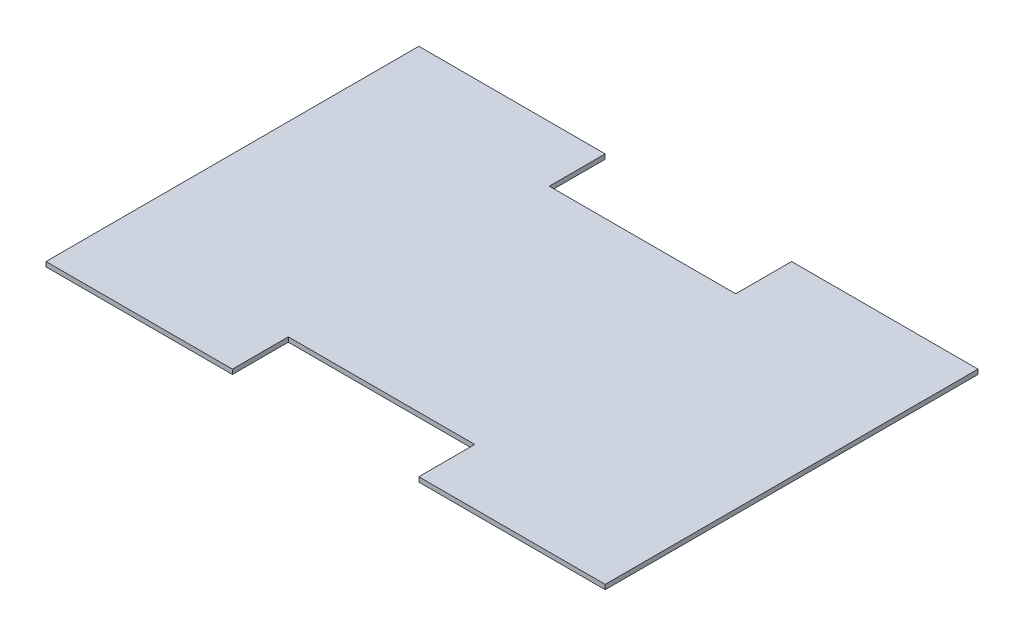
ISO-10303-21;
HEADER;
FILE_DESCRIPTION(('STEP AP214'),'2;1');
FILE_NAME('part.step','',(''),(''),'','','');
FILE_SCHEMA(('AUTOMOTIVE_DESIGN { 1 0 10303 214 1 1 1 1 }'));
ENDSEC;
DATA;
#1=APPLICATION_CONTEXT('core data for automotive mechanical design processes');
#2=APPLICATION_PROTOCOL_DEFINITION('international standard','automotive_design',2000,#1);
#3=PRODUCT_CONTEXT('',#1,'mechanical');
#4=PRODUCT('Part','Part','',(#3));
#5=PRODUCT_RELATED_PRODUCT_CATEGORY('part','',(#4));
#6=PRODUCT_DEFINITION_FORMATION('','',#4);
#7=PRODUCT_DEFINITION_CONTEXT('part definition',#1,'design');
#8=PRODUCT_DEFINITION('design','',#6,#7);
#9=PRODUCT_DEFINITION_SHAPE('','',#8);
#10=(LENGTH_UNIT() NAMED_UNIT(*) SI_UNIT(.MILLI.,.METRE.));
#11=(NAMED_UNIT(*) PLANE_ANGLE_UNIT() SI_UNIT($,.RADIAN.));
#12=(NAMED_UNIT(*) SI_UNIT($,.STERADIAN.) SOLID_ANGLE_UNIT());
#13=UNCERTAINTY_MEASURE_WITH_UNIT(LENGTH_MEASURE(1.E-05),#10,'distance_accuracy_value','');
#14=(GEOMETRIC_REPRESENTATION_CONTEXT(3) GLOBAL_UNCERTAINTY_ASSIGNED_CONTEXT((#13)) GLOBAL_UNIT_ASSIGNED_CONTEXT((#10,
#11,#12)) REPRESENTATION_CONTEXT('',''));
#15=CARTESIAN_POINT('',(0.,0.,0.));
#16=DIRECTION('',(0.,0.,1.));
#17=DIRECTION('',(1.,0.,0.));
#18=AXIS2_PLACEMENT_3D('',#15,#16,#17);
#19=CARTESIAN_POINT('',(-300.,5.,-200.));
#20=DIRECTION('',(0.,0.,1.));
#21=DIRECTION('',(1.,0.,0.));
#22=AXIS2_PLACEMENT_3D('',#19,#20,#21);
#23=PLANE('',#22);
#24=DIRECTION('',(0.,1.,0.));
#25=VECTOR('',#24,1.);
#26=CARTESIAN_POINT('',(100.,0.,-200.));
#27=LINE('',#26,#25);
#28=CARTESIAN_POINT('',(100.,0.,-200.));
#29=VERTEX_POINT('',#28);
#30=CARTESIAN_POINT('',(100.,5.,-200.));
#31=VERTEX_POINT('',#30);
#32=EDGE_CURVE('E62',#29,#31,#27,.T.);
#33=ORIENTED_EDGE('',*,*,#32,.T.);
#34=DIRECTION('',(-1.,0.,0.));
#35=VECTOR('',#34,1.);
#36=CARTESIAN_POINT('',(-300.,5.,-200.));
#37=LINE('',#36,#35);
#38=CARTESIAN_POINT('',(300.,5.,-200.));
#39=VERTEX_POINT('',#38);
#40=EDGE_CURVE('E211',#39,#31,#37,.T.);
#41=ORIENTED_EDGE('',*,*,#40,.F.);
#42=DIRECTION('',(0.,-1.,0.));
#43=VECTOR('',#42,1.);
#44=CARTESIAN_POINT('',(300.,5.,-200.));
#45=LINE('',#44,#43);
#46=CARTESIAN_POINT('',(300.,0.,-200.));
#47=VERTEX_POINT('',#46);
#48=EDGE_CURVE('E11',#39,#47,#45,.T.);
#49=ORIENTED_EDGE('',*,*,#48,.T.);
#50=DIRECTION('',(-1.,0.,0.));
#51=VECTOR('',#50,1.);
#52=CARTESIAN_POINT('',(-300.,0.,-200.));
#53=LINE('',#52,#51);
#54=EDGE_CURVE('E228',#47,#29,#53,.T.);
#55=ORIENTED_EDGE('',*,*,#54,.T.);
#56=EDGE_LOOP('',(#33,#41,#49,#55));
#57=FACE_BOUND('',#56,.T.);
#58=ADVANCED_FACE('F38',(#57),#23,.F.);
#59=CARTESIAN_POINT('',(-300.,5.,200.));
#60=DIRECTION('',(0.,0.,-1.));
#61=DIRECTION('',(-1.,0.,0.));
#62=AXIS2_PLACEMENT_3D('',#59,#60,#61);
#63=PLANE('',#62);
#64=DIRECTION('',(0.,1.,0.));
#65=VECTOR('',#64,1.);
#66=CARTESIAN_POINT('',(-100.,0.,200.));
#67=LINE('',#66,#65);
#68=CARTESIAN_POINT('',(-100.,0.,200.));
#69=VERTEX_POINT('',#68);
#70=CARTESIAN_POINT('',(-100.,5.,200.));
#71=VERTEX_POINT('',#70);
#72=EDGE_CURVE('E183',#69,#71,#67,.T.);
#73=ORIENTED_EDGE('',*,*,#72,.T.);
#74=DIRECTION('',(1.,0.,0.));
#75=VECTOR('',#74,1.);
#76=CARTESIAN_POINT('',(-300.,5.,200.));
#77=LINE('',#76,#75);
#78=CARTESIAN_POINT('',(-300.,5.,200.));
#79=VERTEX_POINT('',#78);
#80=EDGE_CURVE('E219',#79,#71,#77,.T.);
#81=ORIENTED_EDGE('',*,*,#80,.F.);
#82=DIRECTION('',(0.,-1.,0.));
#83=VECTOR('',#82,1.);
#84=CARTESIAN_POINT('',(-300.,5.,200.));
#85=LINE('',#84,#83);
#86=CARTESIAN_POINT('',(-300.,0.,200.));
#87=VERTEX_POINT('',#86);
#88=EDGE_CURVE('E241',#79,#87,#85,.T.);
#89=ORIENTED_EDGE('',*,*,#88,.T.);
#90=DIRECTION('',(1.,0.,0.));
#91=VECTOR('',#90,1.);
#92=CARTESIAN_POINT('',(-300.,0.,200.));
#93=LINE('',#92,#91);
#94=EDGE_CURVE('E210',#87,#69,#93,.T.);
#95=ORIENTED_EDGE('',*,*,#94,.T.);
#96=EDGE_LOOP('',(#73,#81,#89,#95));
#97=FACE_BOUND('',#96,.T.);
#98=ADVANCED_FACE('F258',(#97),#63,.F.);
#99=CARTESIAN_POINT('',(0.,5.,0.));
#100=DIRECTION('',(0.,-1.,0.));
#101=DIRECTION('',(0.,0.,-1.));
#102=AXIS2_PLACEMENT_3D('',#99,#100,#101);
#103=PLANE('',#102);
#104=DIRECTION('',(1.,0.,0.));
#105=VECTOR('',#104,1.);
#106=CARTESIAN_POINT('',(0.,5.,-140.));
#107=LINE('',#106,#105);
#108=CARTESIAN_POINT('',(-100.,5.,-140.));
#109=VERTEX_POINT('',#108);
#110=CARTESIAN_POINT('',(100.,5.,-140.));
#111=VERTEX_POINT('',#110);
#112=EDGE_CURVE('E142',#109,#111,#107,.T.);
#113=ORIENTED_EDGE('',*,*,#112,.F.);
#114=DIRECTION('',(0.,0.,1.));
#115=VECTOR('',#114,1.);
#116=CARTESIAN_POINT('',(-99.9999999999999,5.,0.));
#117=LINE('',#116,#115);
#118=CARTESIAN_POINT('',(-100.,5.,-200.));
#119=VERTEX_POINT('',#118);
#120=EDGE_CURVE('E149',#119,#109,#117,.T.);
#121=ORIENTED_EDGE('',*,*,#120,.F.);
#122=CARTESIAN_POINT('',(-300.,5.,-200.));
#123=VERTEX_POINT('',#122);
#124=EDGE_CURVE('E209',#119,#123,#37,.T.);
#125=ORIENTED_EDGE('',*,*,#124,.T.);
#126=DIRECTION('',(0.,0.,1.));
#127=VECTOR('',#126,1.);
#128=CARTESIAN_POINT('',(-300.,5.,200.));
#129=LINE('',#128,#127);
#130=EDGE_CURVE('E215',#123,#79,#129,.T.);
#131=ORIENTED_EDGE('',*,*,#130,.T.);
#132=ORIENTED_EDGE('',*,*,#80,.T.);
#133=DIRECTION('',(0.,0.,-1.));
#134=VECTOR('',#133,1.);
#135=CARTESIAN_POINT('',(-100.,5.,0.));
#136=LINE('',#135,#134);
#137=CARTESIAN_POINT('',(-100.,5.,140.));
#138=VERTEX_POINT('',#137);
#139=EDGE_CURVE('E184',#71,#138,#136,.T.);
#140=ORIENTED_EDGE('',*,*,#139,.T.);
#141=DIRECTION('',(1.,0.,0.));
#142=VECTOR('',#141,1.);
#143=CARTESIAN_POINT('',(0.,5.,140.));
#144=LINE('',#143,#142);
#145=CARTESIAN_POINT('',(100.,5.,140.));
#146=VERTEX_POINT('',#145);
#147=EDGE_CURVE('E176',#138,#146,#144,.T.);
#148=ORIENTED_EDGE('',*,*,#147,.T.);
#149=DIRECTION('',(0.,0.,-1.));
#150=VECTOR('',#149,1.);
#151=CARTESIAN_POINT('',(99.9999999999999,5.,0.));
#152=LINE('',#151,#150);
#153=CARTESIAN_POINT('',(100.,5.,200.));
#154=VERTEX_POINT('',#153);
#155=EDGE_CURVE('E188',#154,#146,#152,.T.);
#156=ORIENTED_EDGE('',*,*,#155,.F.);
#157=CARTESIAN_POINT('',(300.,5.,200.));
#158=VERTEX_POINT('',#157);
#159=EDGE_CURVE('E218',#154,#158,#77,.T.);
#160=ORIENTED_EDGE('',*,*,#159,.T.);
#161=DIRECTION('',(0.,0.,-1.));
#162=VECTOR('',#161,1.);
#163=CARTESIAN_POINT('',(300.,5.,200.));
#164=LINE('',#163,#162);
#165=EDGE_CURVE('E205',#158,#39,#164,.T.);
#166=ORIENTED_EDGE('',*,*,#165,.T.);
#167=ORIENTED_EDGE('',*,*,#40,.T.);
#168=DIRECTION('',(0.,0.,1.));
#169=VECTOR('',#168,1.);
#170=CARTESIAN_POINT('',(99.9999999999999,5.,0.));
#171=LINE('',#170,#169);
#172=EDGE_CURVE('E153',#31,#111,#171,.T.);
#173=ORIENTED_EDGE('',*,*,#172,.T.);
#174=EDGE_LOOP('',(#113,#121,#125,#131,#132,#140,#148,#156,#160,#166,#167,#173));
#175=FACE_BOUND('',#174,.T.);
#176=ADVANCED_FACE('F261',(#175),#103,.F.);
#177=CARTESIAN_POINT('',(0.,0.,0.));
#178=DIRECTION('',(0.,-1.,0.));
#179=DIRECTION('',(0.,0.,-1.));
#180=AXIS2_PLACEMENT_3D('',#177,#178,#179);
#181=PLANE('',#180);
#182=DIRECTION('',(0.,0.,1.));
#183=VECTOR('',#182,1.);
#184=CARTESIAN_POINT('',(-99.9999999999999,0.,0.));
#185=LINE('',#184,#183);
#186=CARTESIAN_POINT('',(-100.,0.,-200.));
#187=VERTEX_POINT('',#186);
#188=CARTESIAN_POINT('',(-100.,0.,-140.));
#189=VERTEX_POINT('',#188);
#190=EDGE_CURVE('E134',#187,#189,#185,.T.);
#191=ORIENTED_EDGE('',*,*,#190,.T.);
#192=DIRECTION('',(1.,0.,0.));
#193=VECTOR('',#192,1.);
#194=CARTESIAN_POINT('',(0.,0.,-140.));
#195=LINE('',#194,#193);
#196=CARTESIAN_POINT('',(100.,0.,-140.));
#197=VERTEX_POINT('',#196);
#198=EDGE_CURVE('E135',#189,#197,#195,.T.);
#199=ORIENTED_EDGE('',*,*,#198,.T.);
#200=DIRECTION('',(0.,0.,1.));
#201=VECTOR('',#200,1.);
#202=CARTESIAN_POINT('',(99.9999999999999,0.,0.));
#203=LINE('',#202,#201);
#204=EDGE_CURVE('E125',#29,#197,#203,.T.);
#205=ORIENTED_EDGE('',*,*,#204,.F.);
#206=ORIENTED_EDGE('',*,*,#54,.F.);
#207=DIRECTION('',(0.,0.,-1.));
#208=VECTOR('',#207,1.);
#209=CARTESIAN_POINT('',(300.,0.,200.));
#210=LINE('',#209,#208);
#211=CARTESIAN_POINT('',(300.,0.,200.));
#212=VERTEX_POINT('',#211);
#213=EDGE_CURVE('E166',#212,#47,#210,.T.);
#214=ORIENTED_EDGE('',*,*,#213,.F.);
#215=CARTESIAN_POINT('',(100.,0.,200.));
#216=VERTEX_POINT('',#215);
#217=EDGE_CURVE('E234',#216,#212,#93,.T.);
#218=ORIENTED_EDGE('',*,*,#217,.F.);
#219=DIRECTION('',(0.,0.,-1.));
#220=VECTOR('',#219,1.);
#221=CARTESIAN_POINT('',(99.9999999999999,0.,0.));
#222=LINE('',#221,#220);
#223=CARTESIAN_POINT('',(100.,0.,140.));
#224=VERTEX_POINT('',#223);
#225=EDGE_CURVE('E175',#216,#224,#222,.T.);
#226=ORIENTED_EDGE('',*,*,#225,.T.);
#227=DIRECTION('',(1.,0.,0.));
#228=VECTOR('',#227,1.);
#229=CARTESIAN_POINT('',(0.,0.,140.));
#230=LINE('',#229,#228);
#231=CARTESIAN_POINT('',(-100.,0.,140.));
#232=VERTEX_POINT('',#231);
#233=EDGE_CURVE('E180',#232,#224,#230,.T.);
#234=ORIENTED_EDGE('',*,*,#233,.F.);
#235=DIRECTION('',(0.,0.,-1.));
#236=VECTOR('',#235,1.);
#237=CARTESIAN_POINT('',(-100.,0.,0.));
#238=LINE('',#237,#236);
#239=EDGE_CURVE('E172',#69,#232,#238,.T.);
#240=ORIENTED_EDGE('',*,*,#239,.F.);
#241=ORIENTED_EDGE('',*,*,#94,.F.);
#242=DIRECTION('',(0.,0.,1.));
#243=VECTOR('',#242,1.);
#244=CARTESIAN_POINT('',(-300.,0.,200.));
#245=LINE('',#244,#243);
#246=CARTESIAN_POINT('',(-300.,0.,-200.));
#247=VERTEX_POINT('',#246);
#248=EDGE_CURVE('E231',#247,#87,#245,.T.);
#249=ORIENTED_EDGE('',*,*,#248,.F.);
#250=EDGE_CURVE('E227',#187,#247,#53,.T.);
#251=ORIENTED_EDGE('',*,*,#250,.F.);
#252=EDGE_LOOP('',(#191,#199,#205,#206,#214,#218,#226,#234,#240,#241,#249,#251));
#253=FACE_BOUND('',#252,.T.);
#254=ADVANCED_FACE('F146',(#253),#181,.T.);
#255=CARTESIAN_POINT('',(300.,5.,200.));
#256=DIRECTION('',(-1.,0.,0.));
#257=DIRECTION('',(0.,0.,1.));
#258=AXIS2_PLACEMENT_3D('',#255,#256,#257);
#259=PLANE('',#258);
#260=ORIENTED_EDGE('',*,*,#213,.T.);
#261=ORIENTED_EDGE('',*,*,#48,.F.);
#262=ORIENTED_EDGE('',*,*,#165,.F.);
#263=DIRECTION('',(0.,-1.,0.));
#264=VECTOR('',#263,1.);
#265=CARTESIAN_POINT('',(300.,5.,200.));
#266=LINE('',#265,#264);
#267=EDGE_CURVE('E223',#158,#212,#266,.T.);
#268=ORIENTED_EDGE('',*,*,#267,.T.);
#269=EDGE_LOOP('',(#260,#261,#262,#268));
#270=FACE_BOUND('',#269,.T.);
#271=ADVANCED_FACE('F40',(#270),#259,.F.);
#272=ORIENTED_EDGE('',*,*,#124,.F.);
#273=DIRECTION('',(0.,1.,0.));
#274=VECTOR('',#273,1.);
#275=CARTESIAN_POINT('',(-100.,0.,-200.));
#276=LINE('',#275,#274);
#277=EDGE_CURVE('E167',#187,#119,#276,.T.);
#278=ORIENTED_EDGE('',*,*,#277,.F.);
#279=ORIENTED_EDGE('',*,*,#250,.T.);
#280=DIRECTION('',(0.,-1.,0.));
#281=VECTOR('',#280,1.);
#282=CARTESIAN_POINT('',(-300.,5.,-200.));
#283=LINE('',#282,#281);
#284=EDGE_CURVE('E47',#123,#247,#283,.T.);
#285=ORIENTED_EDGE('',*,*,#284,.F.);
#286=EDGE_LOOP('',(#272,#278,#279,#285));
#287=FACE_BOUND('',#286,.T.);
#288=ADVANCED_FACE('F267',(#287),#23,.F.);
#289=CARTESIAN_POINT('',(-300.,5.,200.));
#290=DIRECTION('',(1.,0.,0.));
#291=DIRECTION('',(0.,0.,-1.));
#292=AXIS2_PLACEMENT_3D('',#289,#290,#291);
#293=PLANE('',#292);
#294=ORIENTED_EDGE('',*,*,#248,.T.);
#295=ORIENTED_EDGE('',*,*,#88,.F.);
#296=ORIENTED_EDGE('',*,*,#130,.F.);
#297=ORIENTED_EDGE('',*,*,#284,.T.);
#298=EDGE_LOOP('',(#294,#295,#296,#297));
#299=FACE_BOUND('',#298,.T.);
#300=ADVANCED_FACE('F250',(#299),#293,.F.);
#301=ORIENTED_EDGE('',*,*,#159,.F.);
#302=DIRECTION('',(0.,1.,0.));
#303=VECTOR('',#302,1.);
#304=CARTESIAN_POINT('',(100.,0.,200.));
#305=LINE('',#304,#303);
#306=EDGE_CURVE('E199',#216,#154,#305,.T.);
#307=ORIENTED_EDGE('',*,*,#306,.F.);
#308=ORIENTED_EDGE('',*,*,#217,.T.);
#309=ORIENTED_EDGE('',*,*,#267,.F.);
#310=EDGE_LOOP('',(#301,#307,#308,#309));
#311=FACE_BOUND('',#310,.T.);
#312=ADVANCED_FACE('F279',(#311),#63,.F.);
#313=CARTESIAN_POINT('',(-100.,0.,0.));
#314=DIRECTION('',(1.,0.,0.));
#315=DIRECTION('',(0.,0.,-1.));
#316=AXIS2_PLACEMENT_3D('',#313,#314,#315);
#317=PLANE('',#316);
#318=ORIENTED_EDGE('',*,*,#139,.F.);
#319=ORIENTED_EDGE('',*,*,#72,.F.);
#320=ORIENTED_EDGE('',*,*,#239,.T.);
#321=DIRECTION('',(0.,1.,0.));
#322=VECTOR('',#321,1.);
#323=CARTESIAN_POINT('',(-100.,0.,140.));
#324=LINE('',#323,#322);
#325=EDGE_CURVE('E160',#232,#138,#324,.T.);
#326=ORIENTED_EDGE('',*,*,#325,.T.);
#327=EDGE_LOOP('',(#318,#319,#320,#326));
#328=FACE_BOUND('',#327,.T.);
#329=ADVANCED_FACE('F287',(#328),#317,.T.);
#330=CARTESIAN_POINT('',(0.,0.,140.));
#331=DIRECTION('',(0.,0.,1.));
#332=DIRECTION('',(1.,0.,0.));
#333=AXIS2_PLACEMENT_3D('',#330,#331,#332);
#334=PLANE('',#333);
#335=ORIENTED_EDGE('',*,*,#147,.F.);
#336=ORIENTED_EDGE('',*,*,#325,.F.);
#337=ORIENTED_EDGE('',*,*,#233,.T.);
#338=DIRECTION('',(0.,1.,0.));
#339=VECTOR('',#338,1.);
#340=CARTESIAN_POINT('',(100.,0.,140.));
#341=LINE('',#340,#339);
#342=EDGE_CURVE('E54',#224,#146,#341,.T.);
#343=ORIENTED_EDGE('',*,*,#342,.T.);
#344=EDGE_LOOP('',(#335,#336,#337,#343));
#345=FACE_BOUND('',#344,.T.);
#346=ADVANCED_FACE('F285',(#345),#334,.T.);
#347=CARTESIAN_POINT('',(99.9999999999999,0.,0.));
#348=DIRECTION('',(1.,0.,0.));
#349=DIRECTION('',(0.,0.,-1.));
#350=AXIS2_PLACEMENT_3D('',#347,#348,#349);
#351=PLANE('',#350);
#352=ORIENTED_EDGE('',*,*,#155,.T.);
#353=ORIENTED_EDGE('',*,*,#342,.F.);
#354=ORIENTED_EDGE('',*,*,#225,.F.);
#355=ORIENTED_EDGE('',*,*,#306,.T.);
#356=EDGE_LOOP('',(#352,#353,#354,#355));
#357=FACE_BOUND('',#356,.T.);
#358=ADVANCED_FACE('F282',(#357),#351,.F.);
#359=CARTESIAN_POINT('',(0.,0.,-140.));
#360=DIRECTION('',(0.,0.,1.));
#361=DIRECTION('',(1.,0.,0.));
#362=AXIS2_PLACEMENT_3D('',#359,#360,#361);
#363=PLANE('',#362);
#364=ORIENTED_EDGE('',*,*,#112,.T.);
#365=DIRECTION('',(0.,1.,0.));
#366=VECTOR('',#365,1.);
#367=CARTESIAN_POINT('',(100.,0.,-140.));
#368=LINE('',#367,#366);
#369=EDGE_CURVE('E128',#197,#111,#368,.T.);
#370=ORIENTED_EDGE('',*,*,#369,.F.);
#371=ORIENTED_EDGE('',*,*,#198,.F.);
#372=DIRECTION('',(0.,1.,0.));
#373=VECTOR('',#372,1.);
#374=CARTESIAN_POINT('',(-100.,0.,-140.));
#375=LINE('',#374,#373);
#376=EDGE_CURVE('E163',#189,#109,#375,.T.);
#377=ORIENTED_EDGE('',*,*,#376,.T.);
#378=EDGE_LOOP('',(#364,#370,#371,#377));
#379=FACE_BOUND('',#378,.T.);
#380=ADVANCED_FACE('F139',(#379),#363,.F.);
#381=CARTESIAN_POINT('',(-99.9999999999999,0.,0.));
#382=DIRECTION('',(-1.,0.,0.));
#383=DIRECTION('',(0.,0.,1.));
#384=AXIS2_PLACEMENT_3D('',#381,#382,#383);
#385=PLANE('',#384);
#386=ORIENTED_EDGE('',*,*,#120,.T.);
#387=ORIENTED_EDGE('',*,*,#376,.F.);
#388=ORIENTED_EDGE('',*,*,#190,.F.);
#389=ORIENTED_EDGE('',*,*,#277,.T.);
#390=EDGE_LOOP('',(#386,#387,#388,#389));
#391=FACE_BOUND('',#390,.T.);
#392=ADVANCED_FACE('F269',(#391),#385,.F.);
#393=CARTESIAN_POINT('',(99.9999999999999,0.,0.));
#394=DIRECTION('',(-1.,0.,0.));
#395=DIRECTION('',(0.,0.,1.));
#396=AXIS2_PLACEMENT_3D('',#393,#394,#395);
#397=PLANE('',#396);
#398=ORIENTED_EDGE('',*,*,#172,.F.);
#399=ORIENTED_EDGE('',*,*,#32,.F.);
#400=ORIENTED_EDGE('',*,*,#204,.T.);
#401=ORIENTED_EDGE('',*,*,#369,.T.);
#402=EDGE_LOOP('',(#398,#399,#400,#401));
#403=FACE_BOUND('',#402,.T.);
#404=ADVANCED_FACE('F127',(#403),#397,.T.);
#405=CLOSED_SHELL('',(#58,#98,#176,#254,#271,#288,#300,#312,#329,#346,#358,#380,#392,#404));
#406=MANIFOLD_SOLID_BREP('B2',#405);
#407=ADVANCED_BREP_SHAPE_REPRESENTATION('',(#18,#406),#14);
#408=SHAPE_DEFINITION_REPRESENTATION(#9,#407);
ENDSEC;
END-ISO-10303-21;
